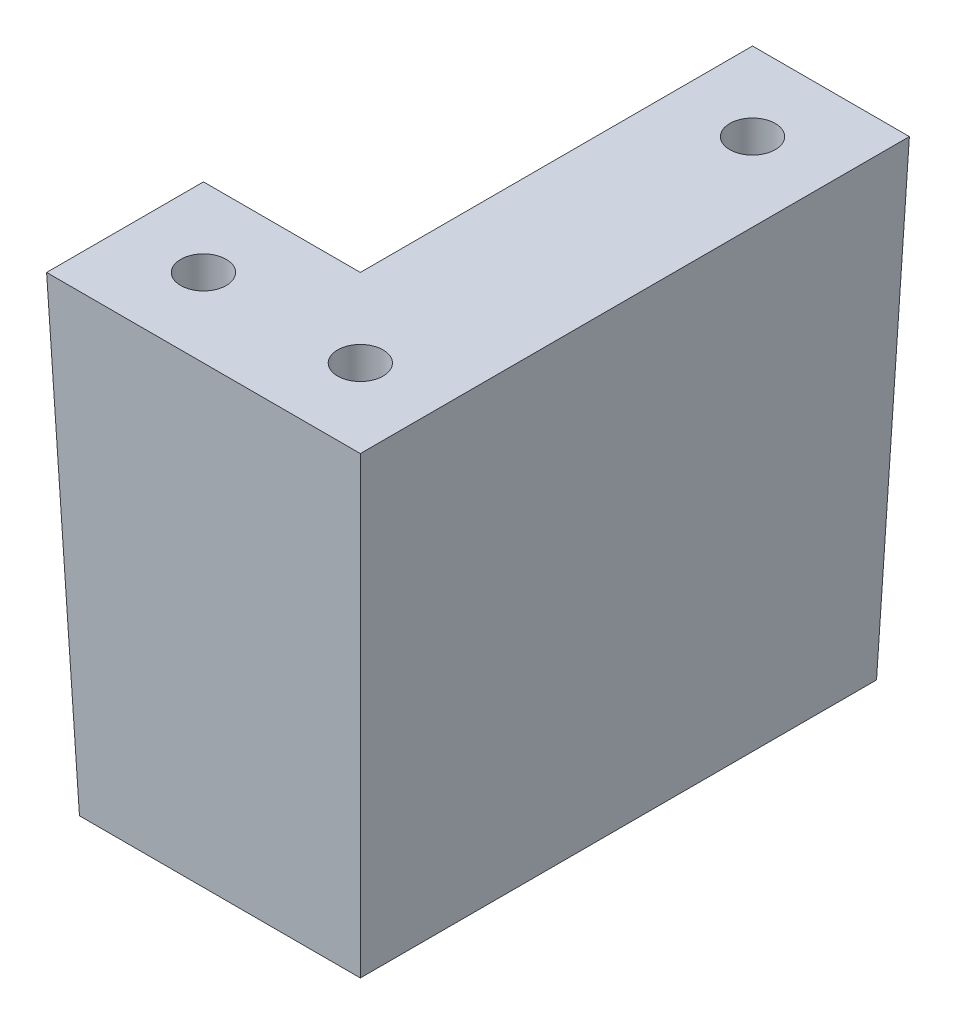
ISO-10303-21;
HEADER;
FILE_DESCRIPTION(('STEP AP214'),'2;1');
FILE_NAME('part.step','',(''),(''),'','','');
FILE_SCHEMA(('AUTOMOTIVE_DESIGN { 1 0 10303 214 1 1 1 1 }'));
ENDSEC;
DATA;
#1=APPLICATION_CONTEXT('core data for automotive mechanical design processes');
#2=APPLICATION_PROTOCOL_DEFINITION('international standard','automotive_design',2000,#1);
#3=PRODUCT_CONTEXT('',#1,'mechanical');
#4=PRODUCT('Part','Part','',(#3));
#5=PRODUCT_RELATED_PRODUCT_CATEGORY('part','',(#4));
#6=PRODUCT_DEFINITION_FORMATION('','',#4);
#7=PRODUCT_DEFINITION_CONTEXT('part definition',#1,'design');
#8=PRODUCT_DEFINITION('design','',#6,#7);
#9=PRODUCT_DEFINITION_SHAPE('','',#8);
#10=(LENGTH_UNIT() NAMED_UNIT(*) SI_UNIT(.MILLI.,.METRE.));
#11=(NAMED_UNIT(*) PLANE_ANGLE_UNIT() SI_UNIT($,.RADIAN.));
#12=(NAMED_UNIT(*) SI_UNIT($,.STERADIAN.) SOLID_ANGLE_UNIT());
#13=UNCERTAINTY_MEASURE_WITH_UNIT(LENGTH_MEASURE(1.E-05),#10,'distance_accuracy_value','');
#14=(GEOMETRIC_REPRESENTATION_CONTEXT(3) GLOBAL_UNCERTAINTY_ASSIGNED_CONTEXT((#13)) GLOBAL_UNIT_ASSIGNED_CONTEXT((#10,
#11,#12)) REPRESENTATION_CONTEXT('',''));
#15=CARTESIAN_POINT('',(0.,0.,0.));
#16=DIRECTION('',(0.,0.,1.));
#17=DIRECTION('',(1.,0.,0.));
#18=AXIS2_PLACEMENT_3D('',#15,#16,#17);
#19=CARTESIAN_POINT('',(0.,0.,0.));
#20=DIRECTION('',(-0.999390827019096,-0.034899496702501,0.));
#21=DIRECTION('',(0.034899496702501,-0.999390827019096,0.));
#22=AXIS2_PLACEMENT_3D('',#19,#20,#21);
#23=PLANE('',#22);
#24=DIRECTION('',(0.,0.,1.));
#25=VECTOR('',#24,1.);
#26=CARTESIAN_POINT('',(0.,0.,0.));
#27=LINE('',#26,#25);
#28=CARTESIAN_POINT('',(0.,0.,-20.));
#29=VERTEX_POINT('',#28);
#30=CARTESIAN_POINT('',(0.,0.,0.));
#31=VERTEX_POINT('',#30);
#32=EDGE_CURVE('E114',#29,#31,#27,.T.);
#33=ORIENTED_EDGE('',*,*,#32,.F.);
#34=DIRECTION('',(-0.0348782627423747,0.998782765958718,-0.0348782627423747));
#35=VECTOR('',#34,1.);
#36=CARTESIAN_POINT('',(0.,0.,-20.));
#37=LINE('',#36,#35);
#38=CARTESIAN_POINT('',(2.09524616950487,-60.,-17.9047538304951));
#39=VERTEX_POINT('',#38);
#40=EDGE_CURVE('E11',#39,#29,#37,.T.);
#41=ORIENTED_EDGE('',*,*,#40,.F.);
#42=DIRECTION('',(0.,0.,1.));
#43=VECTOR('',#42,1.);
#44=CARTESIAN_POINT('',(2.09524616950487,-60.,0.));
#45=LINE('',#44,#43);
#46=CARTESIAN_POINT('',(2.09524616950487,-60.,-2.09524616950487));
#47=VERTEX_POINT('',#46);
#48=EDGE_CURVE('E116',#39,#47,#45,.T.);
#49=ORIENTED_EDGE('',*,*,#48,.T.);
#50=DIRECTION('',(-0.0348782627423747,0.998782765958718,0.0348782627423747));
#51=VECTOR('',#50,1.);
#52=CARTESIAN_POINT('',(0.,0.,0.));
#53=LINE('',#52,#51);
#54=EDGE_CURVE('E87',#47,#31,#53,.T.);
#55=ORIENTED_EDGE('',*,*,#54,.T.);
#56=EDGE_LOOP('',(#33,#41,#49,#55));
#57=FACE_BOUND('',#56,.T.);
#58=ADVANCED_FACE('F43',(#57),#23,.T.);
#59=CARTESIAN_POINT('',(0.,0.,-20.));
#60=DIRECTION('',(0.,-0.034899496702501,-0.999390827019096));
#61=DIRECTION('',(0.,0.999390827019096,-0.034899496702501));
#62=AXIS2_PLACEMENT_3D('',#59,#60,#61);
#63=PLANE('',#62);
#64=DIRECTION('',(-1.,0.,0.));
#65=VECTOR('',#64,1.);
#66=CARTESIAN_POINT('',(0.,0.,-20.));
#67=LINE('',#66,#65);
#68=CARTESIAN_POINT('',(20.,0.,-20.));
#69=VERTEX_POINT('',#68);
#70=EDGE_CURVE('E129',#69,#29,#67,.T.);
#71=ORIENTED_EDGE('',*,*,#70,.F.);
#72=DIRECTION('',(-0.0348782627423747,0.998782765958718,-0.0348782627423747));
#73=VECTOR('',#72,1.);
#74=CARTESIAN_POINT('',(19.9756701357615,0.696716154673278,-20.0243298642385));
#75=LINE('',#74,#73);
#76=CARTESIAN_POINT('',(22.0952461695049,-60.,-17.9047538304951));
#77=VERTEX_POINT('',#76);
#78=EDGE_CURVE('E54',#77,#69,#75,.T.);
#79=ORIENTED_EDGE('',*,*,#78,.F.);
#80=DIRECTION('',(-1.,0.,0.));
#81=VECTOR('',#80,1.);
#82=CARTESIAN_POINT('',(0.,-60.,-17.9047538304951));
#83=LINE('',#82,#81);
#84=EDGE_CURVE('E118',#77,#39,#83,.T.);
#85=ORIENTED_EDGE('',*,*,#84,.T.);
#86=ORIENTED_EDGE('',*,*,#40,.T.);
#87=EDGE_LOOP('',(#71,#79,#85,#86));
#88=FACE_BOUND('',#87,.T.);
#89=ADVANCED_FACE('F45',(#88),#63,.T.);
#90=CARTESIAN_POINT('',(20.,0.,-70.));
#91=DIRECTION('',(-0.999390827019096,-0.034899496702501,0.));
#92=DIRECTION('',(0.034899496702501,-0.999390827019096,0.));
#93=AXIS2_PLACEMENT_3D('',#90,#91,#92);
#94=PLANE('',#93);
#95=DIRECTION('',(0.,0.,1.));
#96=VECTOR('',#95,1.);
#97=CARTESIAN_POINT('',(20.,0.,-70.));
#98=LINE('',#97,#96);
#99=CARTESIAN_POINT('',(20.,0.,-70.));
#100=VERTEX_POINT('',#99);
#101=EDGE_CURVE('E145',#100,#69,#98,.T.);
#102=ORIENTED_EDGE('',*,*,#101,.F.);
#103=DIRECTION('',(-0.0348782627423747,0.998782765958718,-0.0348782627423747));
#104=VECTOR('',#103,1.);
#105=CARTESIAN_POINT('',(20.,0.,-70.));
#106=LINE('',#105,#104);
#107=CARTESIAN_POINT('',(22.0952461695049,-60.,-67.9047538304951));
#108=VERTEX_POINT('',#107);
#109=EDGE_CURVE('E155',#108,#100,#106,.T.);
#110=ORIENTED_EDGE('',*,*,#109,.F.);
#111=DIRECTION('',(0.,0.,1.));
#112=VECTOR('',#111,1.);
#113=CARTESIAN_POINT('',(22.0952461695049,-60.,-70.));
#114=LINE('',#113,#112);
#115=EDGE_CURVE('E164',#108,#77,#114,.T.);
#116=ORIENTED_EDGE('',*,*,#115,.T.);
#117=ORIENTED_EDGE('',*,*,#78,.T.);
#118=EDGE_LOOP('',(#102,#110,#116,#117));
#119=FACE_BOUND('',#118,.T.);
#120=ADVANCED_FACE('F182',(#119),#94,.T.);
#121=CARTESIAN_POINT('',(20.,0.,-70.));
#122=DIRECTION('',(0.,-0.034899496702501,-0.999390827019096));
#123=DIRECTION('',(0.,0.999390827019096,-0.034899496702501));
#124=AXIS2_PLACEMENT_3D('',#121,#122,#123);
#125=PLANE('',#124);
#126=DIRECTION('',(-1.,0.,0.));
#127=VECTOR('',#126,1.);
#128=CARTESIAN_POINT('',(20.,0.,-70.));
#129=LINE('',#128,#127);
#130=CARTESIAN_POINT('',(40.,0.,-70.));
#131=VERTEX_POINT('',#130);
#132=EDGE_CURVE('E141',#131,#100,#129,.T.);
#133=ORIENTED_EDGE('',*,*,#132,.F.);
#134=DIRECTION('',(0.0348782627423747,0.998782765958718,-0.0348782627423747));
#135=VECTOR('',#134,1.);
#136=CARTESIAN_POINT('',(39.9148454751652,-2.43850654135647,-69.9148454751652));
#137=LINE('',#136,#135);
#138=CARTESIAN_POINT('',(37.9047538304951,-60.,-67.9047538304951));
#139=VERTEX_POINT('',#138);
#140=EDGE_CURVE('E152',#139,#131,#137,.T.);
#141=ORIENTED_EDGE('',*,*,#140,.F.);
#142=DIRECTION('',(-1.,0.,0.));
#143=VECTOR('',#142,1.);
#144=CARTESIAN_POINT('',(20.,-60.,-67.9047538304951));
#145=LINE('',#144,#143);
#146=EDGE_CURVE('E167',#139,#108,#145,.T.);
#147=ORIENTED_EDGE('',*,*,#146,.T.);
#148=ORIENTED_EDGE('',*,*,#109,.T.);
#149=EDGE_LOOP('',(#133,#141,#147,#148));
#150=FACE_BOUND('',#149,.T.);
#151=ADVANCED_FACE('F180',(#150),#125,.T.);
#152=CARTESIAN_POINT('',(40.,0.,0.));
#153=DIRECTION('',(0.999390827019096,-0.034899496702501,0.));
#154=DIRECTION('',(0.034899496702501,0.999390827019096,0.));
#155=AXIS2_PLACEMENT_3D('',#152,#153,#154);
#156=PLANE('',#155);
#157=DIRECTION('',(0.,0.,-1.));
#158=VECTOR('',#157,1.);
#159=CARTESIAN_POINT('',(40.,0.,0.));
#160=LINE('',#159,#158);
#161=CARTESIAN_POINT('',(40.,0.,0.));
#162=VERTEX_POINT('',#161);
#163=EDGE_CURVE('E126',#162,#131,#160,.T.);
#164=ORIENTED_EDGE('',*,*,#163,.F.);
#165=DIRECTION('',(0.0348782627423747,0.998782765958718,0.0348782627423747));
#166=VECTOR('',#165,1.);
#167=CARTESIAN_POINT('',(39.951340271523,-1.39343230934656,-0.0486597284770448));
#168=LINE('',#167,#166);
#169=CARTESIAN_POINT('',(37.9047538304951,-60.,-2.09524616950487));
#170=VERTEX_POINT('',#169);
#171=EDGE_CURVE('E80',#170,#162,#168,.T.);
#172=ORIENTED_EDGE('',*,*,#171,.F.);
#173=DIRECTION('',(0.,0.,-1.));
#174=VECTOR('',#173,1.);
#175=CARTESIAN_POINT('',(37.9047538304951,-60.,0.));
#176=LINE('',#175,#174);
#177=EDGE_CURVE('E170',#170,#139,#176,.T.);
#178=ORIENTED_EDGE('',*,*,#177,.T.);
#179=ORIENTED_EDGE('',*,*,#140,.T.);
#180=EDGE_LOOP('',(#164,#172,#178,#179));
#181=FACE_BOUND('',#180,.T.);
#182=ADVANCED_FACE('F181',(#181),#156,.T.);
#183=CARTESIAN_POINT('',(0.,0.,0.));
#184=DIRECTION('',(0.,-0.034899496702501,0.999390827019096));
#185=DIRECTION('',(0.,-0.999390827019096,-0.034899496702501));
#186=AXIS2_PLACEMENT_3D('',#183,#184,#185);
#187=PLANE('',#186);
#188=DIRECTION('',(1.,0.,0.));
#189=VECTOR('',#188,1.);
#190=CARTESIAN_POINT('',(0.,0.,0.));
#191=LINE('',#190,#189);
#192=EDGE_CURVE('E121',#31,#162,#191,.T.);
#193=ORIENTED_EDGE('',*,*,#192,.F.);
#194=ORIENTED_EDGE('',*,*,#54,.F.);
#195=DIRECTION('',(1.,0.,0.));
#196=VECTOR('',#195,1.);
#197=CARTESIAN_POINT('',(0.,-60.,-2.09524616950487));
#198=LINE('',#197,#196);
#199=EDGE_CURVE('E47',#47,#170,#198,.T.);
#200=ORIENTED_EDGE('',*,*,#199,.T.);
#201=ORIENTED_EDGE('',*,*,#171,.T.);
#202=EDGE_LOOP('',(#193,#194,#200,#201));
#203=FACE_BOUND('',#202,.T.);
#204=ADVANCED_FACE('F122',(#203),#187,.T.);
#205=CARTESIAN_POINT('',(0.,-60.,0.));
#206=DIRECTION('',(0.,-1.,0.));
#207=DIRECTION('',(0.,0.,-1.));
#208=AXIS2_PLACEMENT_3D('',#205,#206,#207);
#209=PLANE('',#208);
#210=CARTESIAN_POINT('',(10.,-60.,-9.99999999996308));
#211=DIRECTION('',(0.,-1.,0.));
#212=DIRECTION('',(0.,0.,-1.));
#213=AXIS2_PLACEMENT_3D('',#210,#211,#212);
#214=CIRCLE('',#213,5.74999999999999);
#215=CARTESIAN_POINT('',(10.,-60.,-15.7499999999631));
#216=VERTEX_POINT('',#215);
#217=EDGE_CURVE('E351',#216,#216,#214,.T.);
#218=ORIENTED_EDGE('',*,*,#217,.F.);
#219=EDGE_LOOP('',(#218));
#220=FACE_BOUND('',#219,.T.);
#221=CARTESIAN_POINT('',(30.0000000000011,-60.,-10.));
#222=DIRECTION('',(0.,-1.,0.));
#223=DIRECTION('',(0.,0.,-1.));
#224=AXIS2_PLACEMENT_3D('',#221,#222,#223);
#225=CIRCLE('',#224,5.74999999999999);
#226=CARTESIAN_POINT('',(30.0000000000011,-60.,-15.75));
#227=VERTEX_POINT('',#226);
#228=EDGE_CURVE('E365',#227,#227,#225,.T.);
#229=ORIENTED_EDGE('',*,*,#228,.F.);
#230=EDGE_LOOP('',(#229));
#231=FACE_BOUND('',#230,.T.);
#232=CARTESIAN_POINT('',(30.0000000007019,-60.,-60.));
#233=DIRECTION('',(0.,-1.,0.));
#234=DIRECTION('',(0.,0.,-1.));
#235=AXIS2_PLACEMENT_3D('',#232,#233,#234);
#236=CIRCLE('',#235,5.75);
#237=CARTESIAN_POINT('',(30.0000000007019,-60.,-65.75));
#238=VERTEX_POINT('',#237);
#239=EDGE_CURVE('E381',#238,#238,#236,.T.);
#240=ORIENTED_EDGE('',*,*,#239,.F.);
#241=EDGE_LOOP('',(#240));
#242=FACE_BOUND('',#241,.T.);
#243=ORIENTED_EDGE('',*,*,#48,.F.);
#244=ORIENTED_EDGE('',*,*,#84,.F.);
#245=ORIENTED_EDGE('',*,*,#115,.F.);
#246=ORIENTED_EDGE('',*,*,#146,.F.);
#247=ORIENTED_EDGE('',*,*,#177,.F.);
#248=ORIENTED_EDGE('',*,*,#199,.F.);
#249=EDGE_LOOP('',(#243,#244,#245,#246,#247,#248));
#250=FACE_BOUND('',#249,.T.);
#251=ADVANCED_FACE('F174',(#220,#231,#242,#250),#209,.T.);
#252=CARTESIAN_POINT('',(0.,0.,0.));
#253=DIRECTION('',(0.,-1.,0.));
#254=DIRECTION('',(0.,0.,-1.));
#255=AXIS2_PLACEMENT_3D('',#252,#253,#254);
#256=PLANE('',#255);
#257=CARTESIAN_POINT('',(10.,0.,-9.99999999996308));
#258=DIRECTION('',(0.,-1.,0.));
#259=DIRECTION('',(0.,0.,-1.));
#260=AXIS2_PLACEMENT_3D('',#257,#258,#259);
#261=CIRCLE('',#260,2.89999999999998);
#262=CARTESIAN_POINT('',(10.,0.,-12.8999999999631));
#263=VERTEX_POINT('',#262);
#264=EDGE_CURVE('E361',#263,#263,#261,.T.);
#265=ORIENTED_EDGE('',*,*,#264,.T.);
#266=EDGE_LOOP('',(#265));
#267=FACE_BOUND('',#266,.T.);
#268=CARTESIAN_POINT('',(30.0000000000011,0.,-10.));
#269=DIRECTION('',(0.,-1.,0.));
#270=DIRECTION('',(0.,0.,-1.));
#271=AXIS2_PLACEMENT_3D('',#268,#269,#270);
#272=CIRCLE('',#271,2.89999999999999);
#273=CARTESIAN_POINT('',(30.0000000000011,0.,-12.9));
#274=VERTEX_POINT('',#273);
#275=EDGE_CURVE('E377',#274,#274,#272,.T.);
#276=ORIENTED_EDGE('',*,*,#275,.T.);
#277=EDGE_LOOP('',(#276));
#278=FACE_BOUND('',#277,.T.);
#279=CARTESIAN_POINT('',(30.0000000007019,0.,-60.));
#280=DIRECTION('',(0.,-1.,0.));
#281=DIRECTION('',(0.,0.,-1.));
#282=AXIS2_PLACEMENT_3D('',#279,#280,#281);
#283=CIRCLE('',#282,2.89999999999999);
#284=CARTESIAN_POINT('',(30.0000000007019,0.,-62.9));
#285=VERTEX_POINT('',#284);
#286=EDGE_CURVE('E131',#285,#285,#283,.T.);
#287=ORIENTED_EDGE('',*,*,#286,.T.);
#288=EDGE_LOOP('',(#287));
#289=FACE_BOUND('',#288,.T.);
#290=ORIENTED_EDGE('',*,*,#32,.T.);
#291=ORIENTED_EDGE('',*,*,#192,.T.);
#292=ORIENTED_EDGE('',*,*,#163,.T.);
#293=ORIENTED_EDGE('',*,*,#132,.T.);
#294=ORIENTED_EDGE('',*,*,#101,.T.);
#295=ORIENTED_EDGE('',*,*,#70,.T.);
#296=EDGE_LOOP('',(#290,#291,#292,#293,#294,#295));
#297=FACE_BOUND('',#296,.T.);
#298=ADVANCED_FACE('F128',(#267,#278,#289,#297),#256,.F.);
#299=CARTESIAN_POINT('',(30.0000000007019,-60.,-60.));
#300=DIRECTION('',(0.,-1.,0.));
#301=DIRECTION('',(0.,0.,-1.));
#302=AXIS2_PLACEMENT_3D('',#299,#300,#301);
#303=CYLINDRICAL_SURFACE('',#302,2.89999999999999);
#304=ORIENTED_EDGE('',*,*,#286,.F.);
#305=EDGE_LOOP('',(#304));
#306=FACE_BOUND('',#305,.T.);
#307=CARTESIAN_POINT('',(30.0000000007019,-5.,-60.));
#308=DIRECTION('',(0.,-1.,0.));
#309=DIRECTION('',(0.,0.,-1.));
#310=AXIS2_PLACEMENT_3D('',#307,#308,#309);
#311=CIRCLE('',#310,2.89999999999999);
#312=CARTESIAN_POINT('',(30.0000000007019,-5.,-62.9));
#313=VERTEX_POINT('',#312);
#314=EDGE_CURVE('E135',#313,#313,#311,.T.);
#315=ORIENTED_EDGE('',*,*,#314,.T.);
#316=EDGE_LOOP('',(#315));
#317=FACE_BOUND('',#316,.T.);
#318=ADVANCED_FACE('F221',(#306,#317),#303,.F.);
#319=CARTESIAN_POINT('',(32.9000000007019,-5.,-60.));
#320=DIRECTION('',(0.,1.,0.));
#321=DIRECTION('',(0.,0.,1.));
#322=AXIS2_PLACEMENT_3D('',#319,#320,#321);
#323=PLANE('',#322);
#324=ORIENTED_EDGE('',*,*,#314,.F.);
#325=EDGE_LOOP('',(#324));
#326=FACE_BOUND('',#325,.T.);
#327=CARTESIAN_POINT('',(30.0000000007019,-5.,-60.));
#328=DIRECTION('',(0.,-1.,0.));
#329=DIRECTION('',(0.,0.,-1.));
#330=AXIS2_PLACEMENT_3D('',#327,#328,#329);
#331=CIRCLE('',#330,5.74999999999998);
#332=CARTESIAN_POINT('',(30.0000000007019,-5.,-65.75));
#333=VERTEX_POINT('',#332);
#334=EDGE_CURVE('E385',#333,#333,#331,.T.);
#335=ORIENTED_EDGE('',*,*,#334,.T.);
#336=EDGE_LOOP('',(#335));
#337=FACE_BOUND('',#336,.T.);
#338=ADVANCED_FACE('F226',(#326,#337),#323,.F.);
#339=CARTESIAN_POINT('',(30.0000000007019,-60.,-60.));
#340=DIRECTION('',(0.,-1.,0.));
#341=DIRECTION('',(0.,0.,-1.));
#342=AXIS2_PLACEMENT_3D('',#339,#340,#341);
#343=CYLINDRICAL_SURFACE('',#342,5.74999999999999);
#344=ORIENTED_EDGE('',*,*,#334,.F.);
#345=EDGE_LOOP('',(#344));
#346=FACE_BOUND('',#345,.T.);
#347=ORIENTED_EDGE('',*,*,#239,.T.);
#348=EDGE_LOOP('',(#347));
#349=FACE_BOUND('',#348,.T.);
#350=ADVANCED_FACE('F234',(#346,#349),#343,.F.);
#351=CARTESIAN_POINT('',(30.0000000000011,-60.,-10.));
#352=DIRECTION('',(0.,-1.,0.));
#353=DIRECTION('',(0.,0.,-1.));
#354=AXIS2_PLACEMENT_3D('',#351,#352,#353);
#355=CYLINDRICAL_SURFACE('',#354,2.89999999999999);
#356=ORIENTED_EDGE('',*,*,#275,.F.);
#357=EDGE_LOOP('',(#356));
#358=FACE_BOUND('',#357,.T.);
#359=CARTESIAN_POINT('',(30.0000000000011,-5.,-10.));
#360=DIRECTION('',(0.,-1.,0.));
#361=DIRECTION('',(0.,0.,-1.));
#362=AXIS2_PLACEMENT_3D('',#359,#360,#361);
#363=CIRCLE('',#362,2.89999999999999);
#364=CARTESIAN_POINT('',(30.0000000000011,-5.,-12.9));
#365=VERTEX_POINT('',#364);
#366=EDGE_CURVE('E373',#365,#365,#363,.T.);
#367=ORIENTED_EDGE('',*,*,#366,.T.);
#368=EDGE_LOOP('',(#367));
#369=FACE_BOUND('',#368,.T.);
#370=ADVANCED_FACE('F242',(#358,#369),#355,.F.);
#371=CARTESIAN_POINT('',(32.9000000000011,-5.,-10.));
#372=DIRECTION('',(0.,1.,0.));
#373=DIRECTION('',(0.,0.,1.));
#374=AXIS2_PLACEMENT_3D('',#371,#372,#373);
#375=PLANE('',#374);
#376=ORIENTED_EDGE('',*,*,#366,.F.);
#377=EDGE_LOOP('',(#376));
#378=FACE_BOUND('',#377,.T.);
#379=CARTESIAN_POINT('',(30.0000000000011,-5.,-10.));
#380=DIRECTION('',(0.,-1.,0.));
#381=DIRECTION('',(0.,0.,-1.));
#382=AXIS2_PLACEMENT_3D('',#379,#380,#381);
#383=CIRCLE('',#382,5.74999999999999);
#384=CARTESIAN_POINT('',(30.0000000000011,-5.,-15.75));
#385=VERTEX_POINT('',#384);
#386=EDGE_CURVE('E369',#385,#385,#383,.T.);
#387=ORIENTED_EDGE('',*,*,#386,.T.);
#388=EDGE_LOOP('',(#387));
#389=FACE_BOUND('',#388,.T.);
#390=ADVANCED_FACE('F250',(#378,#389),#375,.F.);
#391=CARTESIAN_POINT('',(30.0000000000011,-60.,-10.));
#392=DIRECTION('',(0.,-1.,0.));
#393=DIRECTION('',(0.,0.,-1.));
#394=AXIS2_PLACEMENT_3D('',#391,#392,#393);
#395=CYLINDRICAL_SURFACE('',#394,5.74999999999999);
#396=ORIENTED_EDGE('',*,*,#386,.F.);
#397=EDGE_LOOP('',(#396));
#398=FACE_BOUND('',#397,.T.);
#399=ORIENTED_EDGE('',*,*,#228,.T.);
#400=EDGE_LOOP('',(#399));
#401=FACE_BOUND('',#400,.T.);
#402=ADVANCED_FACE('F258',(#398,#401),#395,.F.);
#403=CARTESIAN_POINT('',(10.,-60.,-9.99999999996308));
#404=DIRECTION('',(0.,-1.,0.));
#405=DIRECTION('',(0.,0.,-1.));
#406=AXIS2_PLACEMENT_3D('',#403,#404,#405);
#407=CYLINDRICAL_SURFACE('',#406,2.89999999999999);
#408=ORIENTED_EDGE('',*,*,#264,.F.);
#409=EDGE_LOOP('',(#408));
#410=FACE_BOUND('',#409,.T.);
#411=CARTESIAN_POINT('',(10.,-5.,-9.99999999996308));
#412=DIRECTION('',(0.,-1.,0.));
#413=DIRECTION('',(0.,0.,-1.));
#414=AXIS2_PLACEMENT_3D('',#411,#412,#413);
#415=CIRCLE('',#414,2.89999999999999);
#416=CARTESIAN_POINT('',(10.,-5.,-12.8999999999631));
#417=VERTEX_POINT('',#416);
#418=EDGE_CURVE('E355',#417,#417,#415,.T.);
#419=ORIENTED_EDGE('',*,*,#418,.T.);
#420=EDGE_LOOP('',(#419));
#421=FACE_BOUND('',#420,.T.);
#422=ADVANCED_FACE('F266',(#410,#421),#407,.F.);
#423=CARTESIAN_POINT('',(12.9,-5.,-9.99999999996308));
#424=DIRECTION('',(0.,1.,0.));
#425=DIRECTION('',(0.,0.,1.));
#426=AXIS2_PLACEMENT_3D('',#423,#424,#425);
#427=PLANE('',#426);
#428=ORIENTED_EDGE('',*,*,#418,.F.);
#429=EDGE_LOOP('',(#428));
#430=FACE_BOUND('',#429,.T.);
#431=CARTESIAN_POINT('',(10.,-5.,-9.99999999996308));
#432=DIRECTION('',(0.,-1.,0.));
#433=DIRECTION('',(0.,0.,-1.));
#434=AXIS2_PLACEMENT_3D('',#431,#432,#433);
#435=CIRCLE('',#434,5.74999999999999);
#436=CARTESIAN_POINT('',(10.,-5.,-15.7499999999631));
#437=VERTEX_POINT('',#436);
#438=EDGE_CURVE('E348',#437,#437,#435,.T.);
#439=ORIENTED_EDGE('',*,*,#438,.T.);
#440=EDGE_LOOP('',(#439));
#441=FACE_BOUND('',#440,.T.);
#442=ADVANCED_FACE('F272',(#430,#441),#427,.F.);
#443=CARTESIAN_POINT('',(10.,-60.,-9.99999999996308));
#444=DIRECTION('',(0.,-1.,0.));
#445=DIRECTION('',(0.,0.,-1.));
#446=AXIS2_PLACEMENT_3D('',#443,#444,#445);
#447=CYLINDRICAL_SURFACE('',#446,5.74999999999999);
#448=ORIENTED_EDGE('',*,*,#438,.F.);
#449=EDGE_LOOP('',(#448));
#450=FACE_BOUND('',#449,.T.);
#451=ORIENTED_EDGE('',*,*,#217,.T.);
#452=EDGE_LOOP('',(#451));
#453=FACE_BOUND('',#452,.T.);
#454=ADVANCED_FACE('F280',(#450,#453),#447,.F.);
#455=CLOSED_SHELL('',(#58,#89,#120,#151,#182,#204,#251,#298,#318,#338,#350,#370,#390,#402,#422,
#442,#454));
#456=MANIFOLD_SOLID_BREP('B2',#455);
#457=ADVANCED_BREP_SHAPE_REPRESENTATION('',(#18,#456),#14);
#458=SHAPE_DEFINITION_REPRESENTATION(#9,#457);
ENDSEC;
END-ISO-10303-21;
